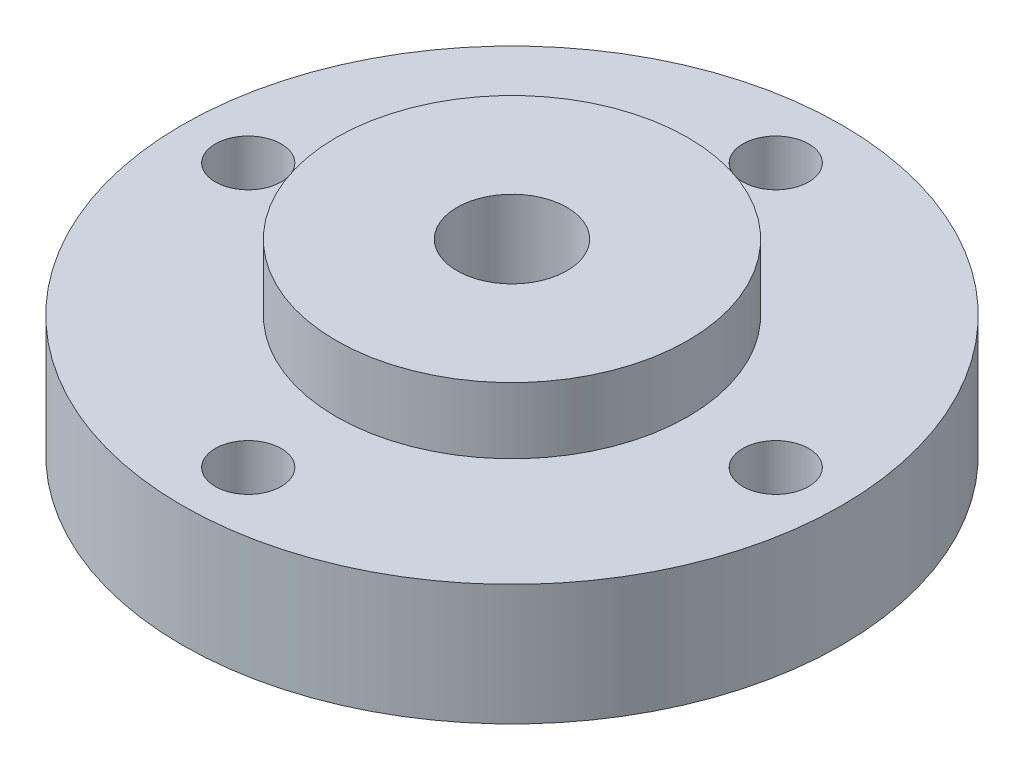
ISO-10303-21;
HEADER;
FILE_DESCRIPTION(('STEP AP214'),'2;1');
FILE_NAME('part.step','',(''),(''),'','','');
FILE_SCHEMA(('AUTOMOTIVE_DESIGN { 1 0 10303 214 1 1 1 1 }'));
ENDSEC;
DATA;
#1=APPLICATION_CONTEXT('core data for automotive mechanical design processes');
#2=APPLICATION_PROTOCOL_DEFINITION('international standard','automotive_design',2000,#1);
#3=PRODUCT_CONTEXT('',#1,'mechanical');
#4=PRODUCT('Part','Part','',(#3));
#5=PRODUCT_RELATED_PRODUCT_CATEGORY('part','',(#4));
#6=PRODUCT_DEFINITION_FORMATION('','',#4);
#7=PRODUCT_DEFINITION_CONTEXT('part definition',#1,'design');
#8=PRODUCT_DEFINITION('design','',#6,#7);
#9=PRODUCT_DEFINITION_SHAPE('','',#8);
#10=(LENGTH_UNIT() NAMED_UNIT(*) SI_UNIT(.MILLI.,.METRE.));
#11=(NAMED_UNIT(*) PLANE_ANGLE_UNIT() SI_UNIT($,.RADIAN.));
#12=(NAMED_UNIT(*) SI_UNIT($,.STERADIAN.) SOLID_ANGLE_UNIT());
#13=UNCERTAINTY_MEASURE_WITH_UNIT(LENGTH_MEASURE(1.E-05),#10,'distance_accuracy_value','');
#14=(GEOMETRIC_REPRESENTATION_CONTEXT(3) GLOBAL_UNCERTAINTY_ASSIGNED_CONTEXT((#13)) GLOBAL_UNIT_ASSIGNED_CONTEXT((#10,
#11,#12)) REPRESENTATION_CONTEXT('',''));
#15=CARTESIAN_POINT('',(0.,0.,0.));
#16=DIRECTION('',(0.,0.,1.));
#17=DIRECTION('',(1.,0.,0.));
#18=AXIS2_PLACEMENT_3D('',#15,#16,#17);
#19=CARTESIAN_POINT('',(0.,8.,0.));
#20=DIRECTION('',(0.,-1.,0.));
#21=DIRECTION('',(0.,0.,-1.));
#22=AXIS2_PLACEMENT_3D('',#19,#20,#21);
#23=CYLINDRICAL_SURFACE('',#22,2.5);
#24=CARTESIAN_POINT('',(0.,7.25,0.));
#25=DIRECTION('',(0.,-1.,0.));
#26=DIRECTION('',(0.,0.,-1.));
#27=AXIS2_PLACEMENT_3D('',#24,#25,#26);
#28=CIRCLE('',#27,2.5);
#29=CARTESIAN_POINT('',(0.,7.25,-2.5));
#30=VERTEX_POINT('',#29);
#31=EDGE_CURVE('E67',#30,#30,#28,.F.);
#32=ORIENTED_EDGE('',*,*,#31,.T.);
#33=EDGE_LOOP('',(#32));
#34=FACE_BOUND('',#33,.T.);
#35=CARTESIAN_POINT('',(0.,0.75,0.));
#36=DIRECTION('',(0.,-1.,0.));
#37=DIRECTION('',(0.,0.,-1.));
#38=AXIS2_PLACEMENT_3D('',#35,#36,#37);
#39=CIRCLE('',#38,2.5);
#40=CARTESIAN_POINT('',(0.,0.75,-2.5));
#41=VERTEX_POINT('',#40);
#42=EDGE_CURVE('E36',#41,#41,#39,.T.);
#43=ORIENTED_EDGE('',*,*,#42,.T.);
#44=EDGE_LOOP('',(#43));
#45=FACE_BOUND('',#44,.T.);
#46=ADVANCED_FACE('F32',(#34,#45),#23,.F.);
#47=CARTESIAN_POINT('',(0.,7.25,0.));
#48=DIRECTION('',(0.,-1.,0.));
#49=DIRECTION('',(0.,0.,-1.));
#50=AXIS2_PLACEMENT_3D('',#47,#48,#49);
#51=CYLINDRICAL_SURFACE('',#50,8.);
#52=CARTESIAN_POINT('',(0.,4.25,0.));
#53=DIRECTION('',(0.,1.,0.));
#54=DIRECTION('',(0.,0.,1.));
#55=AXIS2_PLACEMENT_3D('',#52,#53,#54);
#56=CIRCLE('',#55,8.);
#57=CARTESIAN_POINT('',(0.,4.25,-8.));
#58=VERTEX_POINT('',#57);
#59=EDGE_CURVE('E10',#58,#58,#56,.F.);
#60=CARTESIAN_POINT('',(0.,7.25,0.));
#61=DIRECTION('',(0.,-1.,0.));
#62=DIRECTION('',(0.,0.,-1.));
#63=AXIS2_PLACEMENT_3D('',#60,#61,#62);
#64=CIRCLE('',#63,8.);
#65=CARTESIAN_POINT('',(0.,7.25,-8.));
#66=VERTEX_POINT('',#65);
#67=EDGE_CURVE('E40',#66,#66,#64,.T.);
#68=CARTESIAN_POINT('',(0.,4.25,-8.));
#69=CARTESIAN_POINT('',(0.,4.28125,-8.));
#70=CARTESIAN_POINT('',(0.,4.3125,-8.));
#71=CARTESIAN_POINT('',(0.,4.375,-8.));
#72=CARTESIAN_POINT('',(0.,4.40625,-8.));
#73=CARTESIAN_POINT('',(0.,4.46875,-8.));
#74=CARTESIAN_POINT('',(0.,4.5,-8.));
#75=CARTESIAN_POINT('',(0.,4.5625,-8.));
#76=CARTESIAN_POINT('',(0.,4.59375,-8.));
#77=CARTESIAN_POINT('',(0.,4.65625,-8.));
#78=CARTESIAN_POINT('',(0.,4.6875,-8.));
#79=CARTESIAN_POINT('',(0.,4.75,-8.));
#80=CARTESIAN_POINT('',(0.,4.78125,-8.));
#81=CARTESIAN_POINT('',(0.,4.84375,-8.));
#82=CARTESIAN_POINT('',(0.,4.875,-8.));
#83=CARTESIAN_POINT('',(0.,4.9375,-8.));
#84=CARTESIAN_POINT('',(0.,4.96875,-8.));
#85=CARTESIAN_POINT('',(0.,5.03125,-8.));
#86=CARTESIAN_POINT('',(0.,5.0625,-8.));
#87=CARTESIAN_POINT('',(0.,5.125,-8.));
#88=CARTESIAN_POINT('',(0.,5.15625,-8.));
#89=CARTESIAN_POINT('',(0.,5.21875,-8.));
#90=CARTESIAN_POINT('',(0.,5.25,-8.));
#91=CARTESIAN_POINT('',(0.,5.3125,-8.));
#92=CARTESIAN_POINT('',(0.,5.34375,-8.));
#93=CARTESIAN_POINT('',(0.,5.40625,-8.));
#94=CARTESIAN_POINT('',(0.,5.4375,-8.));
#95=CARTESIAN_POINT('',(0.,5.5,-8.));
#96=CARTESIAN_POINT('',(0.,5.53125,-8.));
#97=CARTESIAN_POINT('',(0.,5.59375,-8.));
#98=CARTESIAN_POINT('',(0.,5.625,-8.));
#99=CARTESIAN_POINT('',(0.,5.6875,-8.));
#100=CARTESIAN_POINT('',(0.,5.71875,-8.));
#101=CARTESIAN_POINT('',(0.,5.78125,-8.));
#102=CARTESIAN_POINT('',(0.,5.8125,-8.));
#103=CARTESIAN_POINT('',(0.,5.875,-8.));
#104=CARTESIAN_POINT('',(0.,5.90625,-8.));
#105=CARTESIAN_POINT('',(0.,5.96875,-8.));
#106=CARTESIAN_POINT('',(0.,6.,-8.));
#107=CARTESIAN_POINT('',(0.,6.0625,-8.));
#108=CARTESIAN_POINT('',(0.,6.09375,-8.));
#109=CARTESIAN_POINT('',(0.,6.15625,-8.));
#110=CARTESIAN_POINT('',(0.,6.1875,-8.));
#111=CARTESIAN_POINT('',(0.,6.25,-8.));
#112=CARTESIAN_POINT('',(0.,6.28125,-8.));
#113=CARTESIAN_POINT('',(0.,6.34375,-8.));
#114=CARTESIAN_POINT('',(0.,6.375,-8.));
#115=CARTESIAN_POINT('',(0.,6.4375,-8.));
#116=CARTESIAN_POINT('',(0.,6.46875,-8.));
#117=CARTESIAN_POINT('',(0.,6.53125,-8.));
#118=CARTESIAN_POINT('',(0.,6.5625,-8.));
#119=CARTESIAN_POINT('',(0.,6.625,-8.));
#120=CARTESIAN_POINT('',(0.,6.65625,-8.));
#121=CARTESIAN_POINT('',(0.,6.71875,-8.));
#122=CARTESIAN_POINT('',(0.,6.75,-8.));
#123=CARTESIAN_POINT('',(0.,6.8125,-8.));
#124=CARTESIAN_POINT('',(0.,6.84375,-8.));
#125=CARTESIAN_POINT('',(0.,6.90625,-8.));
#126=CARTESIAN_POINT('',(0.,6.9375,-8.));
#127=CARTESIAN_POINT('',(0.,7.,-8.));
#128=CARTESIAN_POINT('',(0.,7.03125,-8.));
#129=CARTESIAN_POINT('',(0.,7.09375,-8.));
#130=CARTESIAN_POINT('',(0.,7.125,-8.));
#131=CARTESIAN_POINT('',(0.,7.1875,-8.));
#132=CARTESIAN_POINT('',(0.,7.21875,-8.));
#133=CARTESIAN_POINT('',(0.,7.25,-8.));
#134=B_SPLINE_CURVE_WITH_KNOTS('',3,(#68,#69,#70,#71,#72,#73,#74,#75,#76,#77,#78,#79,#80,#81,
#82,#83,#84,#85,#86,#87,#88,#89,#90,#91,#92,#93,#94,#95,#96,#97,#98,#99,#100,#101,#102,#103,
#104,#105,#106,#107,#108,#109,#110,#111,#112,#113,#114,#115,#116,#117,#118,#119,#120,#121,#122,
#123,#124,#125,#126,#127,#128,#129,#130,#131,#132,#133),.UNSPECIFIED.,.F.,.F.,(4,2,2,2,2,2,2,2,
2,2,2,2,2,2,2,2,2,2,2,2,2,2,2,2,2,2,2,2,2,2,2,2,4),(0.,0.0937500000000001,0.1875,0.28125,0.375,
0.46875,0.5625,0.65625,0.75,0.84375,0.9375,1.03125,1.125,1.21875,1.3125,1.40625,1.5,1.59375,
1.6875,1.78125,1.875,1.96875,2.0625,2.15625,2.25,2.34375,2.4375,2.53125,2.625,2.71875,2.8125,
2.90625,3.),.UNSPECIFIED.);
#135=EDGE_CURVE('BSEAM111',#58,#66,#134,.T.);
#136=ORIENTED_EDGE('',*,*,#59,.F.);
#137=ORIENTED_EDGE('',*,*,#67,.T.);
#138=ORIENTED_EDGE('',*,*,#135,.T.);
#139=ORIENTED_EDGE('',*,*,#135,.F.);
#140=EDGE_LOOP('',(#136,#138,#137,#139));
#141=FACE_BOUND('',#140,.T.);
#142=ADVANCED_FACE('F111',(#141),#51,.T.);
#143=CARTESIAN_POINT('',(0.,7.25,0.));
#144=DIRECTION('',(0.,-1.,0.));
#145=DIRECTION('',(0.,0.,-1.));
#146=AXIS2_PLACEMENT_3D('',#143,#144,#145);
#147=PLANE('',#146);
#148=ORIENTED_EDGE('',*,*,#31,.F.);
#149=EDGE_LOOP('',(#148));
#150=FACE_BOUND('',#149,.T.);
#151=ORIENTED_EDGE('',*,*,#67,.F.);
#152=EDGE_LOOP('',(#151));
#153=FACE_BOUND('',#152,.T.);
#154=ADVANCED_FACE('F105',(#150,#153),#147,.F.);
#155=CARTESIAN_POINT('',(0.,4.25,0.));
#156=DIRECTION('',(0.,1.,0.));
#157=DIRECTION('',(0.,0.,1.));
#158=AXIS2_PLACEMENT_3D('',#155,#156,#157);
#159=PLANE('',#158);
#160=CARTESIAN_POINT('',(0.,4.25,-12.));
#161=DIRECTION('',(0.,1.,0.));
#162=DIRECTION('',(0.,0.,1.));
#163=AXIS2_PLACEMENT_3D('',#160,#161,#162);
#164=CIRCLE('',#163,1.5);
#165=CARTESIAN_POINT('',(0.,4.25,-10.5));
#166=VERTEX_POINT('',#165);
#167=EDGE_CURVE('E63',#166,#166,#164,.T.);
#168=ORIENTED_EDGE('',*,*,#167,.F.);
#169=EDGE_LOOP('',(#168));
#170=FACE_BOUND('',#169,.T.);
#171=CARTESIAN_POINT('',(-12.,4.25,5.16947595841089E-13));
#172=DIRECTION('',(0.,1.,0.));
#173=DIRECTION('',(0.,0.,1.));
#174=AXIS2_PLACEMENT_3D('',#171,#172,#173);
#175=CIRCLE('',#174,1.5);
#176=CARTESIAN_POINT('',(-12.,4.25,1.50000000000052));
#177=VERTEX_POINT('',#176);
#178=EDGE_CURVE('E60',#177,#177,#175,.T.);
#179=ORIENTED_EDGE('',*,*,#178,.F.);
#180=EDGE_LOOP('',(#179));
#181=FACE_BOUND('',#180,.T.);
#182=CARTESIAN_POINT('',(12.0000000000005,4.25,5.09599715046204E-13));
#183=DIRECTION('',(0.,1.,0.));
#184=DIRECTION('',(0.,0.,1.));
#185=AXIS2_PLACEMENT_3D('',#182,#183,#184);
#186=CIRCLE('',#185,1.50000000000016);
#187=CARTESIAN_POINT('',(12.0000000000005,4.25,1.50000000000067));
#188=VERTEX_POINT('',#187);
#189=EDGE_CURVE('E57',#188,#188,#186,.T.);
#190=ORIENTED_EDGE('',*,*,#189,.F.);
#191=EDGE_LOOP('',(#190));
#192=FACE_BOUND('',#191,.T.);
#193=CARTESIAN_POINT('',(0.,4.25,12.));
#194=DIRECTION('',(0.,1.,0.));
#195=DIRECTION('',(0.,0.,1.));
#196=AXIS2_PLACEMENT_3D('',#193,#194,#195);
#197=CIRCLE('',#196,1.5);
#198=CARTESIAN_POINT('',(0.,4.25,13.5));
#199=VERTEX_POINT('',#198);
#200=EDGE_CURVE('E53',#199,#199,#197,.T.);
#201=ORIENTED_EDGE('',*,*,#200,.F.);
#202=EDGE_LOOP('',(#201));
#203=FACE_BOUND('',#202,.T.);
#204=ORIENTED_EDGE('',*,*,#59,.T.);
#205=EDGE_LOOP('',(#204));
#206=FACE_BOUND('',#205,.T.);
#207=CARTESIAN_POINT('',(0.,4.25,0.));
#208=DIRECTION('',(0.,1.,0.));
#209=DIRECTION('',(0.,0.,1.));
#210=AXIS2_PLACEMENT_3D('',#207,#208,#209);
#211=CIRCLE('',#210,15.);
#212=CARTESIAN_POINT('',(0.,4.25,15.));
#213=VERTEX_POINT('',#212);
#214=EDGE_CURVE('E78',#213,#213,#211,.T.);
#215=ORIENTED_EDGE('',*,*,#214,.T.);
#216=EDGE_LOOP('',(#215));
#217=FACE_BOUND('',#216,.T.);
#218=ADVANCED_FACE('F101',(#170,#181,#192,#203,#206,#217),#159,.T.);
#219=CARTESIAN_POINT('',(0.,3.,0.));
#220=DIRECTION('',(0.,-1.,0.));
#221=DIRECTION('',(0.,0.,-1.));
#222=AXIS2_PLACEMENT_3D('',#219,#220,#221);
#223=CYLINDRICAL_SURFACE('',#222,15.);
#224=CARTESIAN_POINT('',(0.,-1.25,0.));
#225=DIRECTION('',(0.,1.,0.));
#226=DIRECTION('',(0.,0.,1.));
#227=AXIS2_PLACEMENT_3D('',#224,#225,#226);
#228=CIRCLE('',#227,15.);
#229=CARTESIAN_POINT('',(0.,-1.25,15.));
#230=VERTEX_POINT('',#229);
#231=EDGE_CURVE('E81',#230,#230,#228,.T.);
#232=ORIENTED_EDGE('',*,*,#231,.T.);
#233=EDGE_LOOP('',(#232));
#234=FACE_BOUND('',#233,.T.);
#235=ORIENTED_EDGE('',*,*,#214,.F.);
#236=EDGE_LOOP('',(#235));
#237=FACE_BOUND('',#236,.T.);
#238=ADVANCED_FACE('F34',(#234,#237),#223,.T.);
#239=CARTESIAN_POINT('',(0.,-1.25,0.));
#240=DIRECTION('',(0.,1.,0.));
#241=DIRECTION('',(0.,0.,1.));
#242=AXIS2_PLACEMENT_3D('',#239,#240,#241);
#243=PLANE('',#242);
#244=CARTESIAN_POINT('',(0.,-1.25,-12.));
#245=DIRECTION('',(0.,1.,0.));
#246=DIRECTION('',(0.,0.,1.));
#247=AXIS2_PLACEMENT_3D('',#244,#245,#246);
#248=CIRCLE('',#247,1.5);
#249=CARTESIAN_POINT('',(0.,-1.25,-10.5));
#250=VERTEX_POINT('',#249);
#251=EDGE_CURVE('E61',#250,#250,#248,.T.);
#252=ORIENTED_EDGE('',*,*,#251,.T.);
#253=EDGE_LOOP('',(#252));
#254=FACE_BOUND('',#253,.T.);
#255=CARTESIAN_POINT('',(-12.,-1.25,5.16947595841089E-13));
#256=DIRECTION('',(0.,1.,0.));
#257=DIRECTION('',(0.,0.,1.));
#258=AXIS2_PLACEMENT_3D('',#255,#256,#257);
#259=CIRCLE('',#258,1.5);
#260=CARTESIAN_POINT('',(-12.,-1.25,1.50000000000052));
#261=VERTEX_POINT('',#260);
#262=EDGE_CURVE('E58',#261,#261,#259,.T.);
#263=ORIENTED_EDGE('',*,*,#262,.T.);
#264=EDGE_LOOP('',(#263));
#265=FACE_BOUND('',#264,.T.);
#266=CARTESIAN_POINT('',(12.0000000000005,-1.25,5.09599715046204E-13));
#267=DIRECTION('',(0.,1.,0.));
#268=DIRECTION('',(0.,0.,1.));
#269=AXIS2_PLACEMENT_3D('',#266,#267,#268);
#270=CIRCLE('',#269,1.50000000000016);
#271=CARTESIAN_POINT('',(12.0000000000005,-1.25,1.50000000000067));
#272=VERTEX_POINT('',#271);
#273=EDGE_CURVE('E54',#272,#272,#270,.T.);
#274=ORIENTED_EDGE('',*,*,#273,.T.);
#275=EDGE_LOOP('',(#274));
#276=FACE_BOUND('',#275,.T.);
#277=CARTESIAN_POINT('',(0.,-1.25,12.));
#278=DIRECTION('',(0.,1.,0.));
#279=DIRECTION('',(0.,0.,1.));
#280=AXIS2_PLACEMENT_3D('',#277,#278,#279);
#281=CIRCLE('',#280,1.5);
#282=CARTESIAN_POINT('',(0.,-1.25,13.5));
#283=VERTEX_POINT('',#282);
#284=EDGE_CURVE('E50',#283,#283,#281,.T.);
#285=ORIENTED_EDGE('',*,*,#284,.T.);
#286=EDGE_LOOP('',(#285));
#287=FACE_BOUND('',#286,.T.);
#288=CARTESIAN_POINT('',(0.,-1.25,0.));
#289=DIRECTION('',(0.,1.,0.));
#290=DIRECTION('',(0.,0.,1.));
#291=AXIS2_PLACEMENT_3D('',#288,#289,#290);
#292=CIRCLE('',#291,8.);
#293=CARTESIAN_POINT('',(0.,-1.25,-8.));
#294=VERTEX_POINT('',#293);
#295=EDGE_CURVE('E49',#294,#294,#292,.F.);
#296=ORIENTED_EDGE('',*,*,#295,.F.);
#297=EDGE_LOOP('',(#296));
#298=FACE_BOUND('',#297,.T.);
#299=ORIENTED_EDGE('',*,*,#231,.F.);
#300=EDGE_LOOP('',(#299));
#301=FACE_BOUND('',#300,.T.);
#302=ADVANCED_FACE('F92',(#254,#265,#276,#287,#298,#301),#243,.F.);
#303=CARTESIAN_POINT('',(0.,-4.25,0.));
#304=DIRECTION('',(0.,-1.,0.));
#305=DIRECTION('',(0.,0.,-1.));
#306=AXIS2_PLACEMENT_3D('',#303,#304,#305);
#307=PLANE('',#306);
#308=CARTESIAN_POINT('',(0.,-4.25,0.));
#309=DIRECTION('',(0.,-1.,0.));
#310=DIRECTION('',(0.,0.,-1.));
#311=AXIS2_PLACEMENT_3D('',#308,#309,#310);
#312=CIRCLE('',#311,5.);
#313=CARTESIAN_POINT('',(0.,-4.25,-5.));
#314=VERTEX_POINT('',#313);
#315=EDGE_CURVE('E155',#314,#314,#312,.T.);
#316=ORIENTED_EDGE('',*,*,#315,.F.);
#317=EDGE_LOOP('',(#316));
#318=FACE_BOUND('',#317,.T.);
#319=CARTESIAN_POINT('',(0.,-4.25,0.));
#320=DIRECTION('',(0.,-1.,0.));
#321=DIRECTION('',(0.,0.,-1.));
#322=AXIS2_PLACEMENT_3D('',#319,#320,#321);
#323=CIRCLE('',#322,8.);
#324=CARTESIAN_POINT('',(0.,-4.25,-8.));
#325=VERTEX_POINT('',#324);
#326=EDGE_CURVE('E45',#325,#325,#323,.T.);
#327=ORIENTED_EDGE('',*,*,#326,.T.);
#328=EDGE_LOOP('',(#327));
#329=FACE_BOUND('',#328,.T.);
#330=ADVANCED_FACE('F95',(#318,#329),#307,.T.);
#331=CARTESIAN_POINT('',(0.,-4.25,-8.));
#332=CARTESIAN_POINT('',(0.,-4.21875,-8.));
#333=CARTESIAN_POINT('',(0.,-4.1875,-8.));
#334=CARTESIAN_POINT('',(0.,-4.125,-8.));
#335=CARTESIAN_POINT('',(0.,-4.09375,-8.));
#336=CARTESIAN_POINT('',(0.,-4.03125,-8.));
#337=CARTESIAN_POINT('',(0.,-4.,-8.));
#338=CARTESIAN_POINT('',(0.,-3.9375,-8.));
#339=CARTESIAN_POINT('',(0.,-3.90625,-8.));
#340=CARTESIAN_POINT('',(0.,-3.84375,-8.));
#341=CARTESIAN_POINT('',(0.,-3.8125,-8.));
#342=CARTESIAN_POINT('',(0.,-3.75,-8.));
#343=CARTESIAN_POINT('',(0.,-3.71875,-8.));
#344=CARTESIAN_POINT('',(0.,-3.65625,-8.));
#345=CARTESIAN_POINT('',(0.,-3.625,-8.));
#346=CARTESIAN_POINT('',(0.,-3.5625,-8.));
#347=CARTESIAN_POINT('',(0.,-3.53125,-8.));
#348=CARTESIAN_POINT('',(0.,-3.46875,-8.));
#349=CARTESIAN_POINT('',(0.,-3.4375,-8.));
#350=CARTESIAN_POINT('',(0.,-3.375,-8.));
#351=CARTESIAN_POINT('',(0.,-3.34375,-8.));
#352=CARTESIAN_POINT('',(0.,-3.28125,-8.));
#353=CARTESIAN_POINT('',(0.,-3.25,-8.));
#354=CARTESIAN_POINT('',(0.,-3.1875,-8.));
#355=CARTESIAN_POINT('',(0.,-3.15625,-8.));
#356=CARTESIAN_POINT('',(0.,-3.09375,-8.));
#357=CARTESIAN_POINT('',(0.,-3.0625,-8.));
#358=CARTESIAN_POINT('',(0.,-3.,-8.));
#359=CARTESIAN_POINT('',(0.,-2.96875,-8.));
#360=CARTESIAN_POINT('',(0.,-2.90625,-8.));
#361=CARTESIAN_POINT('',(0.,-2.875,-8.));
#362=CARTESIAN_POINT('',(0.,-2.8125,-8.));
#363=CARTESIAN_POINT('',(0.,-2.78125,-8.));
#364=CARTESIAN_POINT('',(0.,-2.71875,-8.));
#365=CARTESIAN_POINT('',(0.,-2.6875,-8.));
#366=CARTESIAN_POINT('',(0.,-2.625,-8.));
#367=CARTESIAN_POINT('',(0.,-2.59375,-8.));
#368=CARTESIAN_POINT('',(0.,-2.53125,-8.));
#369=CARTESIAN_POINT('',(0.,-2.5,-8.));
#370=CARTESIAN_POINT('',(0.,-2.4375,-8.));
#371=CARTESIAN_POINT('',(0.,-2.40625,-8.));
#372=CARTESIAN_POINT('',(0.,-2.34375,-8.));
#373=CARTESIAN_POINT('',(0.,-2.3125,-8.));
#374=CARTESIAN_POINT('',(0.,-2.25,-8.));
#375=CARTESIAN_POINT('',(0.,-2.21875,-8.));
#376=CARTESIAN_POINT('',(0.,-2.15625,-8.));
#377=CARTESIAN_POINT('',(0.,-2.125,-8.));
#378=CARTESIAN_POINT('',(0.,-2.0625,-8.));
#379=CARTESIAN_POINT('',(0.,-2.03125,-8.));
#380=CARTESIAN_POINT('',(0.,-1.96875,-8.));
#381=CARTESIAN_POINT('',(0.,-1.9375,-8.));
#382=CARTESIAN_POINT('',(0.,-1.875,-8.));
#383=CARTESIAN_POINT('',(0.,-1.84375,-8.));
#384=CARTESIAN_POINT('',(0.,-1.78125,-8.));
#385=CARTESIAN_POINT('',(0.,-1.75,-8.));
#386=CARTESIAN_POINT('',(0.,-1.6875,-8.));
#387=CARTESIAN_POINT('',(0.,-1.65625,-8.));
#388=CARTESIAN_POINT('',(0.,-1.59375,-8.));
#389=CARTESIAN_POINT('',(0.,-1.5625,-8.));
#390=CARTESIAN_POINT('',(0.,-1.5,-8.));
#391=CARTESIAN_POINT('',(0.,-1.46875,-8.));
#392=CARTESIAN_POINT('',(0.,-1.40625,-8.));
#393=CARTESIAN_POINT('',(0.,-1.375,-8.));
#394=CARTESIAN_POINT('',(0.,-1.3125,-8.));
#395=CARTESIAN_POINT('',(0.,-1.28125,-8.));
#396=CARTESIAN_POINT('',(0.,-1.25,-8.));
#397=B_SPLINE_CURVE_WITH_KNOTS('',3,(#331,#332,#333,#334,#335,#336,#337,#338,#339,#340,#341,
#342,#343,#344,#345,#346,#347,#348,#349,#350,#351,#352,#353,#354,#355,#356,#357,#358,#359,#360,
#361,#362,#363,#364,#365,#366,#367,#368,#369,#370,#371,#372,#373,#374,#375,#376,#377,#378,#379,
#380,#381,#382,#383,#384,#385,#386,#387,#388,#389,#390,#391,#392,#393,#394,#395,#396),
.UNSPECIFIED.,.F.,.F.,(4,2,2,2,2,2,2,2,2,2,2,2,2,2,2,2,2,2,2,2,2,2,2,2,2,2,2,2,2,2,2,2,4),(0.,
0.0937500000000001,0.1875,0.28125,0.375,0.46875,0.5625,0.656250000000001,0.750000000000001,
0.843749999999999,0.937499999999999,1.03125,1.125,1.21875,1.3125,1.40625,1.5,1.59375,1.6875,
1.78125,1.875,1.96875,2.0625,2.15625,2.25,2.34375,2.4375,2.53125,2.625,2.71875,2.8125,2.90625,
3.),.UNSPECIFIED.);
#398=EDGE_CURVE('BSEAM90',#325,#294,#397,.T.);
#399=ORIENTED_EDGE('',*,*,#326,.F.);
#400=ORIENTED_EDGE('',*,*,#295,.T.);
#401=ORIENTED_EDGE('',*,*,#398,.T.);
#402=ORIENTED_EDGE('',*,*,#398,.F.);
#403=EDGE_LOOP('',(#399,#401,#400,#402));
#404=FACE_BOUND('',#403,.T.);
#405=ADVANCED_FACE('F90',(#404),#51,.T.);
#406=CARTESIAN_POINT('',(0.,-6.75,12.));
#407=DIRECTION('',(0.,1.,0.));
#408=DIRECTION('',(0.,0.,1.));
#409=AXIS2_PLACEMENT_3D('',#406,#407,#408);
#410=CYLINDRICAL_SURFACE('',#409,1.5);
#411=ORIENTED_EDGE('',*,*,#200,.T.);
#412=EDGE_LOOP('',(#411));
#413=FACE_BOUND('',#412,.T.);
#414=ORIENTED_EDGE('',*,*,#284,.F.);
#415=EDGE_LOOP('',(#414));
#416=FACE_BOUND('',#415,.T.);
#417=ADVANCED_FACE('F125',(#413,#416),#410,.F.);
#418=CARTESIAN_POINT('',(12.0000000000005,-6.75,5.09599715046204E-13));
#419=DIRECTION('',(0.,1.,0.));
#420=DIRECTION('',(0.,0.,1.));
#421=AXIS2_PLACEMENT_3D('',#418,#419,#420);
#422=CYLINDRICAL_SURFACE('',#421,1.50000000000016);
#423=ORIENTED_EDGE('',*,*,#189,.T.);
#424=EDGE_LOOP('',(#423));
#425=FACE_BOUND('',#424,.T.);
#426=ORIENTED_EDGE('',*,*,#273,.F.);
#427=EDGE_LOOP('',(#426));
#428=FACE_BOUND('',#427,.T.);
#429=ADVANCED_FACE('F128',(#425,#428),#422,.F.);
#430=CARTESIAN_POINT('',(-12.,-6.75,5.16947595841089E-13));
#431=DIRECTION('',(0.,1.,0.));
#432=DIRECTION('',(0.,0.,1.));
#433=AXIS2_PLACEMENT_3D('',#430,#431,#432);
#434=CYLINDRICAL_SURFACE('',#433,1.5);
#435=ORIENTED_EDGE('',*,*,#178,.T.);
#436=EDGE_LOOP('',(#435));
#437=FACE_BOUND('',#436,.T.);
#438=ORIENTED_EDGE('',*,*,#262,.F.);
#439=EDGE_LOOP('',(#438));
#440=FACE_BOUND('',#439,.T.);
#441=ADVANCED_FACE('F132',(#437,#440),#434,.F.);
#442=CARTESIAN_POINT('',(0.,-6.75,-12.));
#443=DIRECTION('',(0.,1.,0.));
#444=DIRECTION('',(0.,0.,1.));
#445=AXIS2_PLACEMENT_3D('',#442,#443,#444);
#446=CYLINDRICAL_SURFACE('',#445,1.5);
#447=ORIENTED_EDGE('',*,*,#167,.T.);
#448=EDGE_LOOP('',(#447));
#449=FACE_BOUND('',#448,.T.);
#450=ORIENTED_EDGE('',*,*,#251,.F.);
#451=EDGE_LOOP('',(#450));
#452=FACE_BOUND('',#451,.T.);
#453=ADVANCED_FACE('F136',(#449,#452),#446,.F.);
#454=CARTESIAN_POINT('',(0.,0.75,0.));
#455=DIRECTION('',(0.,-1.,0.));
#456=DIRECTION('',(0.,0.,-1.));
#457=AXIS2_PLACEMENT_3D('',#454,#455,#456);
#458=CYLINDRICAL_SURFACE('',#457,5.);
#459=CARTESIAN_POINT('',(0.,0.75,0.));
#460=DIRECTION('',(0.,-1.,0.));
#461=DIRECTION('',(0.,0.,-1.));
#462=AXIS2_PLACEMENT_3D('',#459,#460,#461);
#463=CIRCLE('',#462,5.);
#464=CARTESIAN_POINT('',(0.,0.75,-5.));
#465=VERTEX_POINT('',#464);
#466=EDGE_CURVE('E154',#465,#465,#463,.T.);
#467=ORIENTED_EDGE('',*,*,#466,.F.);
#468=EDGE_LOOP('',(#467));
#469=FACE_BOUND('',#468,.T.);
#470=ORIENTED_EDGE('',*,*,#315,.T.);
#471=EDGE_LOOP('',(#470));
#472=FACE_BOUND('',#471,.T.);
#473=ADVANCED_FACE('F139',(#469,#472),#458,.F.);
#474=CARTESIAN_POINT('',(0.,0.75,0.));
#475=DIRECTION('',(0.,-1.,0.));
#476=DIRECTION('',(0.,0.,-1.));
#477=AXIS2_PLACEMENT_3D('',#474,#475,#476);
#478=PLANE('',#477);
#479=ORIENTED_EDGE('',*,*,#42,.F.);
#480=EDGE_LOOP('',(#479));
#481=FACE_BOUND('',#480,.T.);
#482=ORIENTED_EDGE('',*,*,#466,.T.);
#483=EDGE_LOOP('',(#482));
#484=FACE_BOUND('',#483,.T.);
#485=ADVANCED_FACE('F143',(#481,#484),#478,.T.);
#486=CLOSED_SHELL('',(#46,#142,#154,#218,#238,#302,#330,#405,#417,#429,#441,#453,#473,#485));
#487=MANIFOLD_SOLID_BREP('B2',#486);
#488=ADVANCED_BREP_SHAPE_REPRESENTATION('',(#18,#487),#14);
#489=SHAPE_DEFINITION_REPRESENTATION(#9,#488);
ENDSEC;
END-ISO-10303-21;
